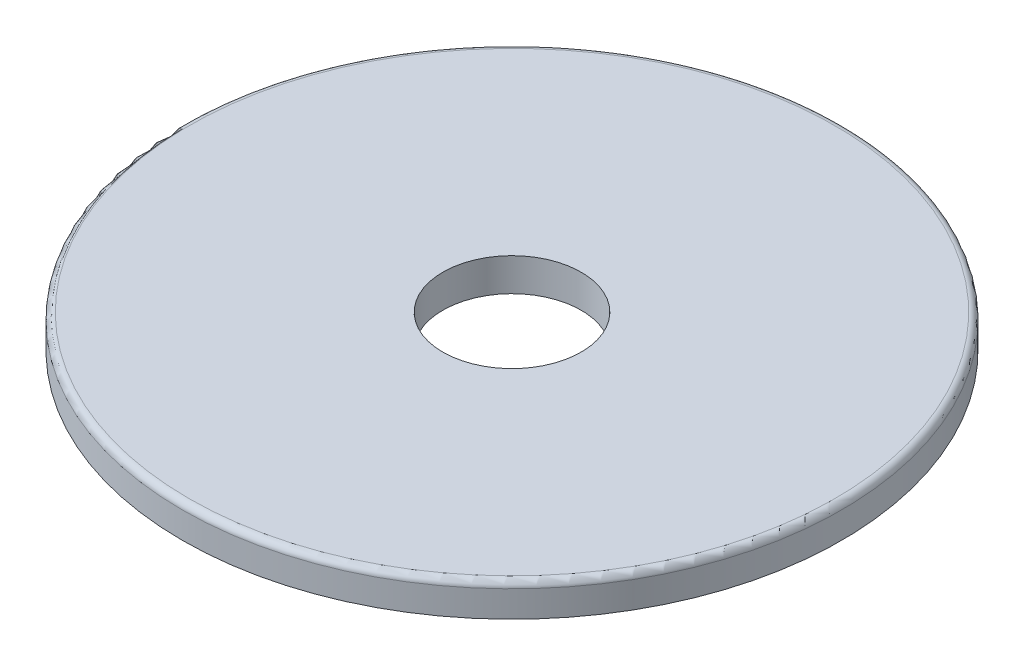
ISO-10303-21;
HEADER;
FILE_DESCRIPTION(('STEP AP214'),'2;1');
FILE_NAME('part.step','',(''),(''),'','','');
FILE_SCHEMA(('AUTOMOTIVE_DESIGN { 1 0 10303 214 1 1 1 1 }'));
ENDSEC;
DATA;
#1=APPLICATION_CONTEXT('core data for automotive mechanical design processes');
#2=APPLICATION_PROTOCOL_DEFINITION('international standard','automotive_design',2000,#1);
#3=PRODUCT_CONTEXT('',#1,'mechanical');
#4=PRODUCT('Part','Part','',(#3));
#5=PRODUCT_RELATED_PRODUCT_CATEGORY('part','',(#4));
#6=PRODUCT_DEFINITION_FORMATION('','',#4);
#7=PRODUCT_DEFINITION_CONTEXT('part definition',#1,'design');
#8=PRODUCT_DEFINITION('design','',#6,#7);
#9=PRODUCT_DEFINITION_SHAPE('','',#8);
#10=(LENGTH_UNIT() NAMED_UNIT(*) SI_UNIT(.MILLI.,.METRE.));
#11=(NAMED_UNIT(*) PLANE_ANGLE_UNIT() SI_UNIT($,.RADIAN.));
#12=(NAMED_UNIT(*) SI_UNIT($,.STERADIAN.) SOLID_ANGLE_UNIT());
#13=UNCERTAINTY_MEASURE_WITH_UNIT(LENGTH_MEASURE(1.E-05),#10,'distance_accuracy_value','');
#14=(GEOMETRIC_REPRESENTATION_CONTEXT(3) GLOBAL_UNCERTAINTY_ASSIGNED_CONTEXT((#13)) GLOBAL_UNIT_ASSIGNED_CONTEXT((#10,
#11,#12)) REPRESENTATION_CONTEXT('',''));
#15=CARTESIAN_POINT('',(0.,0.,0.));
#16=DIRECTION('',(0.,0.,1.));
#17=DIRECTION('',(1.,0.,0.));
#18=AXIS2_PLACEMENT_3D('',#15,#16,#17);
#19=CARTESIAN_POINT('',(0.,1.,0.));
#20=DIRECTION('',(0.,1.,0.));
#21=DIRECTION('',(0.,0.,1.));
#22=AXIS2_PLACEMENT_3D('',#19,#20,#21);
#23=PLANE('',#22);
#24=CARTESIAN_POINT('',(0.,1.,0.));
#25=DIRECTION('',(0.,1.,0.));
#26=DIRECTION('',(0.,0.,1.));
#27=AXIS2_PLACEMENT_3D('',#24,#25,#26);
#28=CIRCLE('',#27,9.8);
#29=CARTESIAN_POINT('',(0.,1.,9.8));
#30=VERTEX_POINT('',#29);
#31=EDGE_CURVE('E40',#30,#30,#28,.T.);
#32=ORIENTED_EDGE('',*,*,#31,.T.);
#33=EDGE_LOOP('',(#32));
#34=FACE_BOUND('',#33,.T.);
#35=CARTESIAN_POINT('',(0.,1.,0.));
#36=DIRECTION('',(0.,1.,0.));
#37=DIRECTION('',(0.,0.,1.));
#38=AXIS2_PLACEMENT_3D('',#35,#36,#37);
#39=CIRCLE('',#38,2.1);
#40=CARTESIAN_POINT('',(0.,1.,2.1));
#41=VERTEX_POINT('',#40);
#42=EDGE_CURVE('E48',#41,#41,#39,.T.);
#43=ORIENTED_EDGE('',*,*,#42,.F.);
#44=EDGE_LOOP('',(#43));
#45=FACE_BOUND('',#44,.T.);
#46=ADVANCED_FACE('F33',(#34,#45),#23,.T.);
#47=CARTESIAN_POINT('',(0.,0.,0.));
#48=DIRECTION('',(0.,1.,0.));
#49=DIRECTION('',(0.,0.,1.));
#50=AXIS2_PLACEMENT_3D('',#47,#48,#49);
#51=PLANE('',#50);
#52=CARTESIAN_POINT('',(0.,0.,0.));
#53=DIRECTION('',(0.,1.,0.));
#54=DIRECTION('',(0.,0.,1.));
#55=AXIS2_PLACEMENT_3D('',#52,#53,#54);
#56=CIRCLE('',#55,10.);
#57=CARTESIAN_POINT('',(0.,0.,10.));
#58=VERTEX_POINT('',#57);
#59=EDGE_CURVE('E44',#58,#58,#56,.T.);
#60=ORIENTED_EDGE('',*,*,#59,.F.);
#61=EDGE_LOOP('',(#60));
#62=FACE_BOUND('',#61,.T.);
#63=CARTESIAN_POINT('',(0.,0.,0.));
#64=DIRECTION('',(0.,1.,0.));
#65=DIRECTION('',(0.,0.,1.));
#66=AXIS2_PLACEMENT_3D('',#63,#64,#65);
#67=CIRCLE('',#66,2.1);
#68=CARTESIAN_POINT('',(0.,0.,2.1));
#69=VERTEX_POINT('',#68);
#70=EDGE_CURVE('E51',#69,#69,#67,.T.);
#71=ORIENTED_EDGE('',*,*,#70,.T.);
#72=EDGE_LOOP('',(#71));
#73=FACE_BOUND('',#72,.T.);
#74=ADVANCED_FACE('F61',(#62,#73),#51,.F.);
#75=CARTESIAN_POINT('',(0.,1.,0.));
#76=DIRECTION('',(0.,-1.,0.));
#77=DIRECTION('',(0.,0.,-1.));
#78=AXIS2_PLACEMENT_3D('',#75,#76,#77);
#79=CYLINDRICAL_SURFACE('',#78,10.);
#80=CARTESIAN_POINT('',(0.,0.8,0.));
#81=DIRECTION('',(0.,1.,0.));
#82=DIRECTION('',(0.,0.,1.));
#83=AXIS2_PLACEMENT_3D('',#80,#81,#82);
#84=CIRCLE('',#83,10.);
#85=CARTESIAN_POINT('',(0.,0.8,10.));
#86=VERTEX_POINT('',#85);
#87=EDGE_CURVE('E10',#86,#86,#84,.F.);
#88=ORIENTED_EDGE('',*,*,#87,.T.);
#89=EDGE_LOOP('',(#88));
#90=FACE_BOUND('',#89,.T.);
#91=ORIENTED_EDGE('',*,*,#59,.T.);
#92=EDGE_LOOP('',(#91));
#93=FACE_BOUND('',#92,.T.);
#94=ADVANCED_FACE('F66',(#90,#93),#79,.T.);
#95=CARTESIAN_POINT('',(0.,1.,0.));
#96=DIRECTION('',(0.,-1.,0.));
#97=DIRECTION('',(0.,0.,-1.));
#98=AXIS2_PLACEMENT_3D('',#95,#96,#97);
#99=CYLINDRICAL_SURFACE('',#98,2.1);
#100=ORIENTED_EDGE('',*,*,#42,.T.);
#101=EDGE_LOOP('',(#100));
#102=FACE_BOUND('',#101,.T.);
#103=ORIENTED_EDGE('',*,*,#70,.F.);
#104=EDGE_LOOP('',(#103));
#105=FACE_BOUND('',#104,.T.);
#106=ADVANCED_FACE('F57',(#102,#105),#99,.F.);
#107=CARTESIAN_POINT('',(0.,0.8,0.));
#108=DIRECTION('',(0.,1.,0.));
#109=DIRECTION('',(0.,0.,1.));
#110=AXIS2_PLACEMENT_3D('',#107,#108,#109);
#111=TOROIDAL_SURFACE('',#110,9.8,0.2);
#112=ORIENTED_EDGE('',*,*,#87,.F.);
#113=EDGE_LOOP('',(#112));
#114=FACE_BOUND('',#113,.T.);
#115=ORIENTED_EDGE('',*,*,#31,.F.);
#116=EDGE_LOOP('',(#115));
#117=FACE_BOUND('',#116,.T.);
#118=ADVANCED_FACE('F35',(#114,#117),#111,.T.);
#119=CLOSED_SHELL('',(#46,#74,#94,#106,#118));
#120=MANIFOLD_SOLID_BREP('B2',#119);
#121=ADVANCED_BREP_SHAPE_REPRESENTATION('',(#18,#120),#14);
#122=SHAPE_DEFINITION_REPRESENTATION(#9,#121);
ENDSEC;
END-ISO-10303-21;
